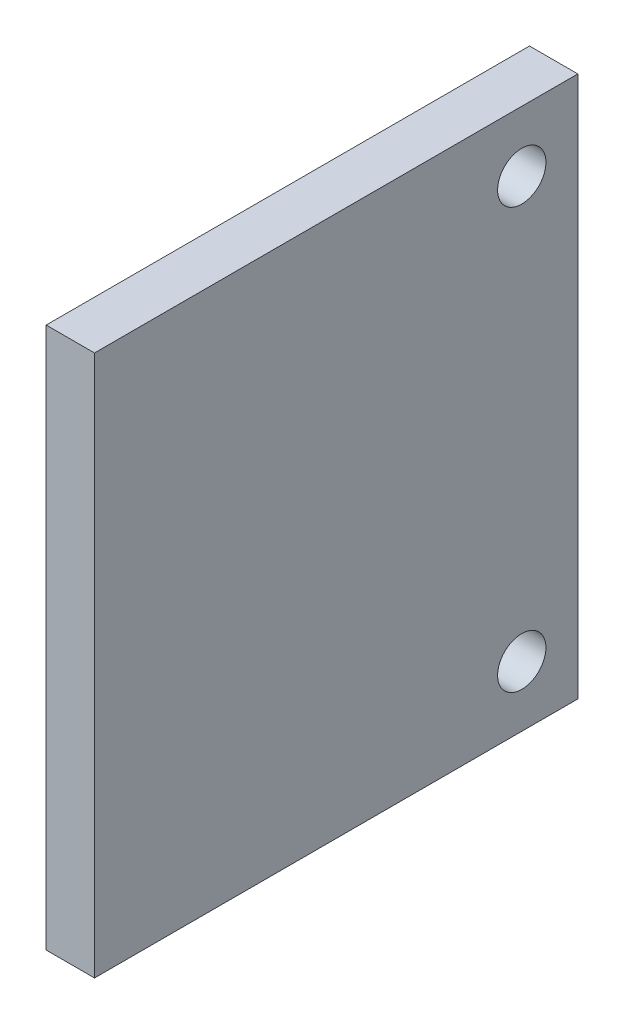
ISO-10303-21;
HEADER;
FILE_DESCRIPTION(('STEP AP214'),'2;1');
FILE_NAME('part.step','',(''),(''),'','','');
FILE_SCHEMA(('AUTOMOTIVE_DESIGN { 1 0 10303 214 1 1 1 1 }'));
ENDSEC;
DATA;
#1=APPLICATION_CONTEXT('core data for automotive mechanical design processes');
#2=APPLICATION_PROTOCOL_DEFINITION('international standard','automotive_design',2000,#1);
#3=PRODUCT_CONTEXT('',#1,'mechanical');
#4=PRODUCT('Part','Part','',(#3));
#5=PRODUCT_RELATED_PRODUCT_CATEGORY('part','',(#4));
#6=PRODUCT_DEFINITION_FORMATION('','',#4);
#7=PRODUCT_DEFINITION_CONTEXT('part definition',#1,'design');
#8=PRODUCT_DEFINITION('design','',#6,#7);
#9=PRODUCT_DEFINITION_SHAPE('','',#8);
#10=(LENGTH_UNIT() NAMED_UNIT(*) SI_UNIT(.MILLI.,.METRE.));
#11=(NAMED_UNIT(*) PLANE_ANGLE_UNIT() SI_UNIT($,.RADIAN.));
#12=(NAMED_UNIT(*) SI_UNIT($,.STERADIAN.) SOLID_ANGLE_UNIT());
#13=UNCERTAINTY_MEASURE_WITH_UNIT(LENGTH_MEASURE(1.E-05),#10,'distance_accuracy_value','');
#14=(GEOMETRIC_REPRESENTATION_CONTEXT(3) GLOBAL_UNCERTAINTY_ASSIGNED_CONTEXT((#13)) GLOBAL_UNIT_ASSIGNED_CONTEXT((#10,
#11,#12)) REPRESENTATION_CONTEXT('',''));
#15=CARTESIAN_POINT('',(0.,0.,0.));
#16=DIRECTION('',(0.,0.,1.));
#17=DIRECTION('',(1.,0.,0.));
#18=AXIS2_PLACEMENT_3D('',#15,#16,#17);
#19=CARTESIAN_POINT('',(2.5,0.,0.));
#20=DIRECTION('',(-1.,0.,0.));
#21=DIRECTION('',(0.,0.,1.));
#22=AXIS2_PLACEMENT_3D('',#19,#20,#21);
#23=PLANE('',#22);
#24=DIRECTION('',(0.,0.,-1.));
#25=VECTOR('',#24,1.);
#26=CARTESIAN_POINT('',(2.5,-14.,-2.9));
#27=LINE('',#26,#25);
#28=CARTESIAN_POINT('',(2.5,-14.,22.1));
#29=VERTEX_POINT('',#28);
#30=CARTESIAN_POINT('',(2.5,-14.,-2.9));
#31=VERTEX_POINT('',#30);
#32=EDGE_CURVE('E91',#29,#31,#27,.T.);
#33=ORIENTED_EDGE('',*,*,#32,.T.);
#34=DIRECTION('',(0.,1.,0.));
#35=VECTOR('',#34,1.);
#36=CARTESIAN_POINT('',(2.5,-14.,-2.9));
#37=LINE('',#36,#35);
#38=CARTESIAN_POINT('',(2.5,14.,-2.9));
#39=VERTEX_POINT('',#38);
#40=EDGE_CURVE('E86',#31,#39,#37,.T.);
#41=ORIENTED_EDGE('',*,*,#40,.T.);
#42=DIRECTION('',(0.,0.,1.));
#43=VECTOR('',#42,1.);
#44=CARTESIAN_POINT('',(2.5,14.,-2.9));
#45=LINE('',#44,#43);
#46=CARTESIAN_POINT('',(2.5,14.,22.1));
#47=VERTEX_POINT('',#46);
#48=EDGE_CURVE('E87',#39,#47,#45,.T.);
#49=ORIENTED_EDGE('',*,*,#48,.T.);
#50=DIRECTION('',(0.,-1.,0.));
#51=VECTOR('',#50,1.);
#52=CARTESIAN_POINT('',(2.5,-14.,22.1));
#53=LINE('',#52,#51);
#54=EDGE_CURVE('E57',#47,#29,#53,.T.);
#55=ORIENTED_EDGE('',*,*,#54,.T.);
#56=EDGE_LOOP('',(#33,#41,#49,#55));
#57=FACE_BOUND('',#56,.T.);
#58=CARTESIAN_POINT('',(2.5,-10.87,0.));
#59=DIRECTION('',(1.,0.,0.));
#60=DIRECTION('',(0.,0.,-1.));
#61=AXIS2_PLACEMENT_3D('',#58,#59,#60);
#62=CIRCLE('',#61,1.25);
#63=CARTESIAN_POINT('',(2.5,-10.87,-1.25));
#64=VERTEX_POINT('',#63);
#65=EDGE_CURVE('E106',#64,#64,#62,.T.);
#66=ORIENTED_EDGE('',*,*,#65,.F.);
#67=EDGE_LOOP('',(#66));
#68=FACE_BOUND('',#67,.T.);
#69=CARTESIAN_POINT('',(2.5,10.87,0.));
#70=DIRECTION('',(1.,0.,0.));
#71=DIRECTION('',(0.,0.,-1.));
#72=AXIS2_PLACEMENT_3D('',#69,#70,#71);
#73=CIRCLE('',#72,1.25);
#74=CARTESIAN_POINT('',(2.5,10.87,-1.25));
#75=VERTEX_POINT('',#74);
#76=EDGE_CURVE('E123',#75,#75,#73,.T.);
#77=ORIENTED_EDGE('',*,*,#76,.F.);
#78=EDGE_LOOP('',(#77));
#79=FACE_BOUND('',#78,.T.);
#80=ADVANCED_FACE('F39',(#57,#68,#79),#23,.F.);
#81=CARTESIAN_POINT('',(0.,0.,0.));
#82=DIRECTION('',(-1.,0.,0.));
#83=DIRECTION('',(0.,0.,1.));
#84=AXIS2_PLACEMENT_3D('',#81,#82,#83);
#85=PLANE('',#84);
#86=CARTESIAN_POINT('',(0.,-10.87,0.));
#87=DIRECTION('',(1.,0.,0.));
#88=DIRECTION('',(0.,0.,-1.));
#89=AXIS2_PLACEMENT_3D('',#86,#87,#88);
#90=CIRCLE('',#89,1.25);
#91=CARTESIAN_POINT('',(0.,-10.87,-1.25));
#92=VERTEX_POINT('',#91);
#93=EDGE_CURVE('E119',#92,#92,#90,.T.);
#94=ORIENTED_EDGE('',*,*,#93,.T.);
#95=EDGE_LOOP('',(#94));
#96=FACE_BOUND('',#95,.T.);
#97=DIRECTION('',(0.,0.,-1.));
#98=VECTOR('',#97,1.);
#99=CARTESIAN_POINT('',(0.,-14.,-2.9));
#100=LINE('',#99,#98);
#101=CARTESIAN_POINT('',(0.,-14.,22.1));
#102=VERTEX_POINT('',#101);
#103=CARTESIAN_POINT('',(0.,-14.,-2.9));
#104=VERTEX_POINT('',#103);
#105=EDGE_CURVE('E104',#102,#104,#100,.T.);
#106=ORIENTED_EDGE('',*,*,#105,.F.);
#107=DIRECTION('',(0.,-1.,0.));
#108=VECTOR('',#107,1.);
#109=CARTESIAN_POINT('',(0.,-14.,22.1));
#110=LINE('',#109,#108);
#111=CARTESIAN_POINT('',(0.,14.,22.1));
#112=VERTEX_POINT('',#111);
#113=EDGE_CURVE('E80',#112,#102,#110,.T.);
#114=ORIENTED_EDGE('',*,*,#113,.F.);
#115=DIRECTION('',(0.,0.,1.));
#116=VECTOR('',#115,1.);
#117=CARTESIAN_POINT('',(0.,14.,-2.9));
#118=LINE('',#117,#116);
#119=CARTESIAN_POINT('',(0.,14.,-2.9));
#120=VERTEX_POINT('',#119);
#121=EDGE_CURVE('E74',#120,#112,#118,.T.);
#122=ORIENTED_EDGE('',*,*,#121,.F.);
#123=DIRECTION('',(0.,1.,0.));
#124=VECTOR('',#123,1.);
#125=CARTESIAN_POINT('',(0.,-14.,-2.9));
#126=LINE('',#125,#124);
#127=EDGE_CURVE('E94',#104,#120,#126,.T.);
#128=ORIENTED_EDGE('',*,*,#127,.F.);
#129=EDGE_LOOP('',(#106,#114,#122,#128));
#130=FACE_BOUND('',#129,.T.);
#131=CARTESIAN_POINT('',(0.,10.87,0.));
#132=DIRECTION('',(1.,0.,0.));
#133=DIRECTION('',(0.,0.,-1.));
#134=AXIS2_PLACEMENT_3D('',#131,#132,#133);
#135=CIRCLE('',#134,1.25);
#136=CARTESIAN_POINT('',(0.,10.87,-1.25));
#137=VERTEX_POINT('',#136);
#138=EDGE_CURVE('E125',#137,#137,#135,.T.);
#139=ORIENTED_EDGE('',*,*,#138,.T.);
#140=EDGE_LOOP('',(#139));
#141=FACE_BOUND('',#140,.T.);
#142=ADVANCED_FACE('F114',(#96,#130,#141),#85,.T.);
#143=CARTESIAN_POINT('',(2.5,-14.,-2.9));
#144=DIRECTION('',(0.,1.,0.));
#145=DIRECTION('',(0.,0.,1.));
#146=AXIS2_PLACEMENT_3D('',#143,#144,#145);
#147=PLANE('',#146);
#148=ORIENTED_EDGE('',*,*,#105,.T.);
#149=DIRECTION('',(-1.,0.,0.));
#150=VECTOR('',#149,1.);
#151=CARTESIAN_POINT('',(2.5,-14.,-2.9));
#152=LINE('',#151,#150);
#153=EDGE_CURVE('E11',#31,#104,#152,.T.);
#154=ORIENTED_EDGE('',*,*,#153,.F.);
#155=ORIENTED_EDGE('',*,*,#32,.F.);
#156=DIRECTION('',(-1.,0.,0.));
#157=VECTOR('',#156,1.);
#158=CARTESIAN_POINT('',(2.5,-14.,22.1));
#159=LINE('',#158,#157);
#160=EDGE_CURVE('E98',#29,#102,#159,.T.);
#161=ORIENTED_EDGE('',*,*,#160,.T.);
#162=EDGE_LOOP('',(#148,#154,#155,#161));
#163=FACE_BOUND('',#162,.T.);
#164=ADVANCED_FACE('F41',(#163),#147,.F.);
#165=CARTESIAN_POINT('',(2.5,-14.,-2.9));
#166=DIRECTION('',(0.,0.,1.));
#167=DIRECTION('',(1.,0.,0.));
#168=AXIS2_PLACEMENT_3D('',#165,#166,#167);
#169=PLANE('',#168);
#170=ORIENTED_EDGE('',*,*,#127,.T.);
#171=DIRECTION('',(-1.,0.,0.));
#172=VECTOR('',#171,1.);
#173=CARTESIAN_POINT('',(2.5,14.,-2.9));
#174=LINE('',#173,#172);
#175=EDGE_CURVE('E48',#39,#120,#174,.T.);
#176=ORIENTED_EDGE('',*,*,#175,.F.);
#177=ORIENTED_EDGE('',*,*,#40,.F.);
#178=ORIENTED_EDGE('',*,*,#153,.T.);
#179=EDGE_LOOP('',(#170,#176,#177,#178));
#180=FACE_BOUND('',#179,.T.);
#181=ADVANCED_FACE('F92',(#180),#169,.F.);
#182=CARTESIAN_POINT('',(2.5,14.,-2.9));
#183=DIRECTION('',(0.,-1.,0.));
#184=DIRECTION('',(0.,0.,-1.));
#185=AXIS2_PLACEMENT_3D('',#182,#183,#184);
#186=PLANE('',#185);
#187=ORIENTED_EDGE('',*,*,#121,.T.);
#188=DIRECTION('',(-1.,0.,0.));
#189=VECTOR('',#188,1.);
#190=CARTESIAN_POINT('',(2.5,14.,22.1));
#191=LINE('',#190,#189);
#192=EDGE_CURVE('E96',#47,#112,#191,.T.);
#193=ORIENTED_EDGE('',*,*,#192,.F.);
#194=ORIENTED_EDGE('',*,*,#48,.F.);
#195=ORIENTED_EDGE('',*,*,#175,.T.);
#196=EDGE_LOOP('',(#187,#193,#194,#195));
#197=FACE_BOUND('',#196,.T.);
#198=ADVANCED_FACE('F100',(#197),#186,.F.);
#199=CARTESIAN_POINT('',(2.5,-14.,22.1));
#200=DIRECTION('',(0.,0.,-1.));
#201=DIRECTION('',(-1.,0.,0.));
#202=AXIS2_PLACEMENT_3D('',#199,#200,#201);
#203=PLANE('',#202);
#204=ORIENTED_EDGE('',*,*,#113,.T.);
#205=ORIENTED_EDGE('',*,*,#160,.F.);
#206=ORIENTED_EDGE('',*,*,#54,.F.);
#207=ORIENTED_EDGE('',*,*,#192,.T.);
#208=EDGE_LOOP('',(#204,#205,#206,#207));
#209=FACE_BOUND('',#208,.T.);
#210=ADVANCED_FACE('F112',(#209),#203,.F.);
#211=CARTESIAN_POINT('',(2.5,-10.87,0.));
#212=DIRECTION('',(-1.,0.,0.));
#213=DIRECTION('',(0.,0.,1.));
#214=AXIS2_PLACEMENT_3D('',#211,#212,#213);
#215=CYLINDRICAL_SURFACE('',#214,1.25);
#216=ORIENTED_EDGE('',*,*,#65,.T.);
#217=EDGE_LOOP('',(#216));
#218=FACE_BOUND('',#217,.T.);
#219=ORIENTED_EDGE('',*,*,#93,.F.);
#220=EDGE_LOOP('',(#219));
#221=FACE_BOUND('',#220,.T.);
#222=ADVANCED_FACE('F141',(#218,#221),#215,.F.);
#223=CARTESIAN_POINT('',(2.5,10.87,0.));
#224=DIRECTION('',(-1.,0.,0.));
#225=DIRECTION('',(0.,0.,1.));
#226=AXIS2_PLACEMENT_3D('',#223,#224,#225);
#227=CYLINDRICAL_SURFACE('',#226,1.25);
#228=ORIENTED_EDGE('',*,*,#76,.T.);
#229=EDGE_LOOP('',(#228));
#230=FACE_BOUND('',#229,.T.);
#231=ORIENTED_EDGE('',*,*,#138,.F.);
#232=EDGE_LOOP('',(#231));
#233=FACE_BOUND('',#232,.T.);
#234=ADVANCED_FACE('F127',(#230,#233),#227,.F.);
#235=CLOSED_SHELL('',(#80,#142,#164,#181,#198,#210,#222,#234));
#236=MANIFOLD_SOLID_BREP('B2',#235);
#237=ADVANCED_BREP_SHAPE_REPRESENTATION('',(#18,#236),#14);
#238=SHAPE_DEFINITION_REPRESENTATION(#9,#237);
ENDSEC;
END-ISO-10303-21;
